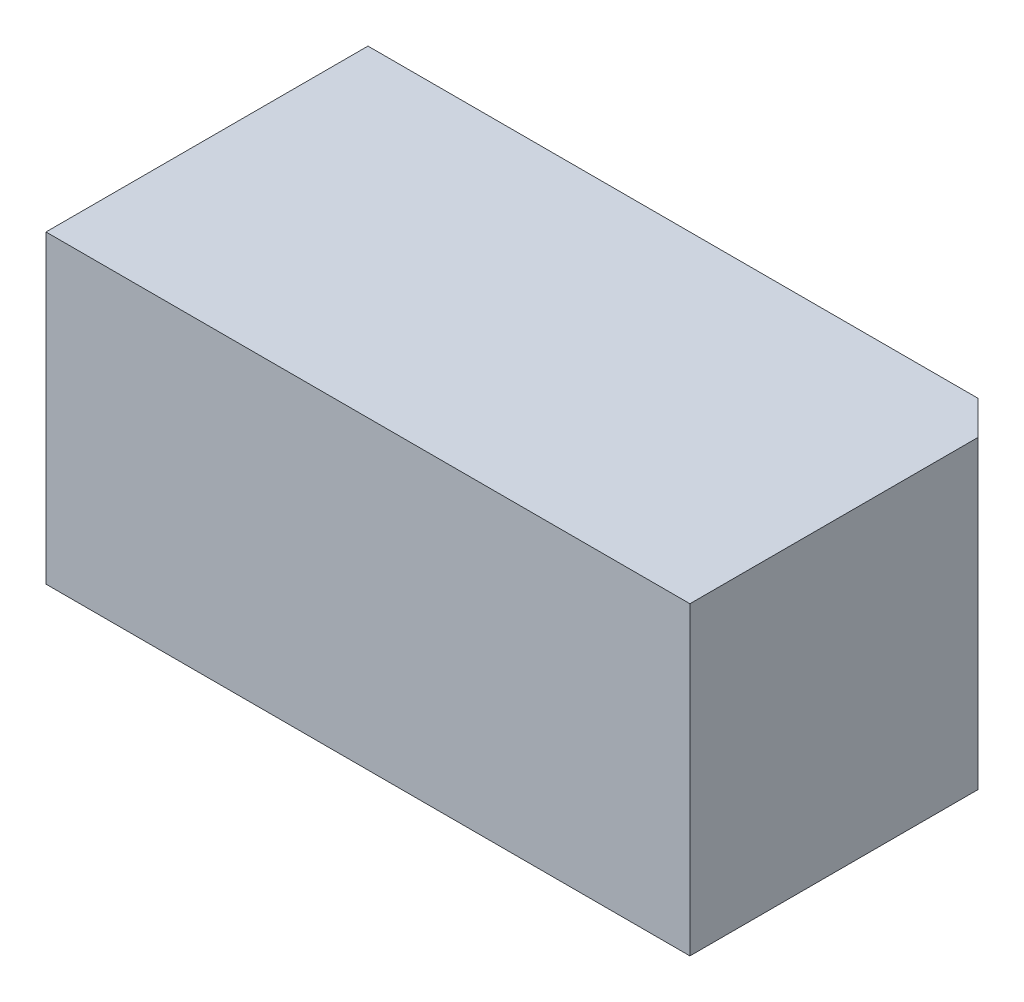
ISO-10303-21;
HEADER;
FILE_DESCRIPTION(('STEP AP214'),'2;1');
FILE_NAME('part.step','',(''),(''),'','','');
FILE_SCHEMA(('AUTOMOTIVE_DESIGN { 1 0 10303 214 1 1 1 1 }'));
ENDSEC;
DATA;
#1=APPLICATION_CONTEXT('core data for automotive mechanical design processes');
#2=APPLICATION_PROTOCOL_DEFINITION('international standard','automotive_design',2000,#1);
#3=PRODUCT_CONTEXT('',#1,'mechanical');
#4=PRODUCT('Part','Part','',(#3));
#5=PRODUCT_RELATED_PRODUCT_CATEGORY('part','',(#4));
#6=PRODUCT_DEFINITION_FORMATION('','',#4);
#7=PRODUCT_DEFINITION_CONTEXT('part definition',#1,'design');
#8=PRODUCT_DEFINITION('design','',#6,#7);
#9=PRODUCT_DEFINITION_SHAPE('','',#8);
#10=(LENGTH_UNIT() NAMED_UNIT(*) SI_UNIT(.MILLI.,.METRE.));
#11=(NAMED_UNIT(*) PLANE_ANGLE_UNIT() SI_UNIT($,.RADIAN.));
#12=(NAMED_UNIT(*) SI_UNIT($,.STERADIAN.) SOLID_ANGLE_UNIT());
#13=UNCERTAINTY_MEASURE_WITH_UNIT(LENGTH_MEASURE(1.E-05),#10,'distance_accuracy_value','');
#14=(GEOMETRIC_REPRESENTATION_CONTEXT(3) GLOBAL_UNCERTAINTY_ASSIGNED_CONTEXT((#13)) GLOBAL_UNIT_ASSIGNED_CONTEXT((#10,
#11,#12)) REPRESENTATION_CONTEXT('',''));
#15=CARTESIAN_POINT('',(0.,0.,0.));
#16=DIRECTION('',(0.,0.,1.));
#17=DIRECTION('',(1.,0.,0.));
#18=AXIS2_PLACEMENT_3D('',#15,#16,#17);
#19=CARTESIAN_POINT('',(-19.,18.,9.5));
#20=DIRECTION('',(1.,0.,0.));
#21=DIRECTION('',(0.,0.,-1.));
#22=AXIS2_PLACEMENT_3D('',#19,#20,#21);
#23=PLANE('',#22);
#24=DIRECTION('',(0.,0.,1.));
#25=VECTOR('',#24,1.);
#26=CARTESIAN_POINT('',(-19.,0.,9.5));
#27=LINE('',#26,#25);
#28=CARTESIAN_POINT('',(-19.,0.,-9.5));
#29=VERTEX_POINT('',#28);
#30=CARTESIAN_POINT('',(-19.,0.,9.5));
#31=VERTEX_POINT('',#30);
#32=EDGE_CURVE('E120',#29,#31,#27,.T.);
#33=ORIENTED_EDGE('',*,*,#32,.T.);
#34=DIRECTION('',(0.,-1.,0.));
#35=VECTOR('',#34,1.);
#36=CARTESIAN_POINT('',(-19.,18.,9.5));
#37=LINE('',#36,#35);
#38=CARTESIAN_POINT('',(-19.,18.,9.5));
#39=VERTEX_POINT('',#38);
#40=EDGE_CURVE('E11',#39,#31,#37,.T.);
#41=ORIENTED_EDGE('',*,*,#40,.F.);
#42=DIRECTION('',(0.,0.,1.));
#43=VECTOR('',#42,1.);
#44=CARTESIAN_POINT('',(-19.,18.,9.5));
#45=LINE('',#44,#43);
#46=CARTESIAN_POINT('',(-19.,18.,-9.5));
#47=VERTEX_POINT('',#46);
#48=EDGE_CURVE('E134',#47,#39,#45,.T.);
#49=ORIENTED_EDGE('',*,*,#48,.F.);
#50=DIRECTION('',(0.,-1.,0.));
#51=VECTOR('',#50,1.);
#52=CARTESIAN_POINT('',(-19.,18.,-9.5));
#53=LINE('',#52,#51);
#54=EDGE_CURVE('E116',#47,#29,#53,.T.);
#55=ORIENTED_EDGE('',*,*,#54,.T.);
#56=EDGE_LOOP('',(#33,#41,#49,#55));
#57=FACE_BOUND('',#56,.T.);
#58=ADVANCED_FACE('F40',(#57),#23,.F.);
#59=CARTESIAN_POINT('',(-19.,18.,9.5));
#60=DIRECTION('',(0.,0.,-1.));
#61=DIRECTION('',(-1.,0.,0.));
#62=AXIS2_PLACEMENT_3D('',#59,#60,#61);
#63=PLANE('',#62);
#64=DIRECTION('',(1.,0.,0.));
#65=VECTOR('',#64,1.);
#66=CARTESIAN_POINT('',(-19.,0.,9.5));
#67=LINE('',#66,#65);
#68=CARTESIAN_POINT('',(19.,0.,9.5));
#69=VERTEX_POINT('',#68);
#70=EDGE_CURVE('E124',#31,#69,#67,.T.);
#71=ORIENTED_EDGE('',*,*,#70,.T.);
#72=DIRECTION('',(0.,-1.,0.));
#73=VECTOR('',#72,1.);
#74=CARTESIAN_POINT('',(19.,18.,9.5));
#75=LINE('',#74,#73);
#76=CARTESIAN_POINT('',(19.,18.,9.5));
#77=VERTEX_POINT('',#76);
#78=EDGE_CURVE('E49',#77,#69,#75,.T.);
#79=ORIENTED_EDGE('',*,*,#78,.F.);
#80=DIRECTION('',(1.,0.,0.));
#81=VECTOR('',#80,1.);
#82=CARTESIAN_POINT('',(-19.,18.,9.5));
#83=LINE('',#82,#81);
#84=EDGE_CURVE('E91',#39,#77,#83,.T.);
#85=ORIENTED_EDGE('',*,*,#84,.F.);
#86=ORIENTED_EDGE('',*,*,#40,.T.);
#87=EDGE_LOOP('',(#71,#79,#85,#86));
#88=FACE_BOUND('',#87,.T.);
#89=ADVANCED_FACE('F158',(#88),#63,.F.);
#90=CARTESIAN_POINT('',(19.,18.,9.5));
#91=DIRECTION('',(-1.,0.,0.));
#92=DIRECTION('',(0.,0.,1.));
#93=AXIS2_PLACEMENT_3D('',#90,#91,#92);
#94=PLANE('',#93);
#95=DIRECTION('',(0.,0.,-1.));
#96=VECTOR('',#95,1.);
#97=CARTESIAN_POINT('',(19.,0.,9.5));
#98=LINE('',#97,#96);
#99=CARTESIAN_POINT('',(19.,0.,-7.5));
#100=VERTEX_POINT('',#99);
#101=EDGE_CURVE('E107',#69,#100,#98,.T.);
#102=ORIENTED_EDGE('',*,*,#101,.T.);
#103=DIRECTION('',(0.,-1.,0.));
#104=VECTOR('',#103,1.);
#105=CARTESIAN_POINT('',(19.,18.,-7.5));
#106=LINE('',#105,#104);
#107=CARTESIAN_POINT('',(19.,18.,-7.5));
#108=VERTEX_POINT('',#107);
#109=EDGE_CURVE('E104',#108,#100,#106,.T.);
#110=ORIENTED_EDGE('',*,*,#109,.F.);
#111=DIRECTION('',(0.,0.,-1.));
#112=VECTOR('',#111,1.);
#113=CARTESIAN_POINT('',(19.,18.,9.5));
#114=LINE('',#113,#112);
#115=EDGE_CURVE('E95',#77,#108,#114,.T.);
#116=ORIENTED_EDGE('',*,*,#115,.F.);
#117=ORIENTED_EDGE('',*,*,#78,.T.);
#118=EDGE_LOOP('',(#102,#110,#116,#117));
#119=FACE_BOUND('',#118,.T.);
#120=ADVANCED_FACE('F105',(#119),#94,.F.);
#121=CARTESIAN_POINT('',(17.,18.,-9.5));
#122=DIRECTION('',(-0.707106781186547,0.,0.707106781186548));
#123=DIRECTION('',(0.707106781186548,0.,0.707106781186547));
#124=AXIS2_PLACEMENT_3D('',#121,#122,#123);
#125=PLANE('',#124);
#126=DIRECTION('',(-0.707106781186548,0.,-0.707106781186547));
#127=VECTOR('',#126,1.);
#128=CARTESIAN_POINT('',(17.,0.,-9.5));
#129=LINE('',#128,#127);
#130=CARTESIAN_POINT('',(17.,0.,-9.5));
#131=VERTEX_POINT('',#130);
#132=EDGE_CURVE('E77',#100,#131,#129,.T.);
#133=ORIENTED_EDGE('',*,*,#132,.T.);
#134=DIRECTION('',(0.,-1.,0.));
#135=VECTOR('',#134,1.);
#136=CARTESIAN_POINT('',(17.,18.,-9.5));
#137=LINE('',#136,#135);
#138=CARTESIAN_POINT('',(17.,18.,-9.5));
#139=VERTEX_POINT('',#138);
#140=EDGE_CURVE('E109',#139,#131,#137,.T.);
#141=ORIENTED_EDGE('',*,*,#140,.F.);
#142=DIRECTION('',(-0.707106781186548,0.,-0.707106781186547));
#143=VECTOR('',#142,1.);
#144=CARTESIAN_POINT('',(17.,18.,-9.5));
#145=LINE('',#144,#143);
#146=EDGE_CURVE('E99',#108,#139,#145,.T.);
#147=ORIENTED_EDGE('',*,*,#146,.F.);
#148=ORIENTED_EDGE('',*,*,#109,.T.);
#149=EDGE_LOOP('',(#133,#141,#147,#148));
#150=FACE_BOUND('',#149,.T.);
#151=ADVANCED_FACE('F111',(#150),#125,.F.);
#152=CARTESIAN_POINT('',(-19.,18.,-9.5));
#153=DIRECTION('',(0.,0.,1.));
#154=DIRECTION('',(1.,0.,0.));
#155=AXIS2_PLACEMENT_3D('',#152,#153,#154);
#156=PLANE('',#155);
#157=DIRECTION('',(-1.,0.,0.));
#158=VECTOR('',#157,1.);
#159=CARTESIAN_POINT('',(-19.,0.,-9.5));
#160=LINE('',#159,#158);
#161=EDGE_CURVE('E83',#131,#29,#160,.T.);
#162=ORIENTED_EDGE('',*,*,#161,.T.);
#163=ORIENTED_EDGE('',*,*,#54,.F.);
#164=DIRECTION('',(-1.,0.,0.));
#165=VECTOR('',#164,1.);
#166=CARTESIAN_POINT('',(-19.,18.,-9.5));
#167=LINE('',#166,#165);
#168=EDGE_CURVE('E57',#139,#47,#167,.T.);
#169=ORIENTED_EDGE('',*,*,#168,.F.);
#170=ORIENTED_EDGE('',*,*,#140,.T.);
#171=EDGE_LOOP('',(#162,#163,#169,#170));
#172=FACE_BOUND('',#171,.T.);
#173=ADVANCED_FACE('F147',(#172),#156,.F.);
#174=CARTESIAN_POINT('',(0.,18.,0.));
#175=DIRECTION('',(0.,-1.,0.));
#176=DIRECTION('',(0.,0.,-1.));
#177=AXIS2_PLACEMENT_3D('',#174,#175,#176);
#178=PLANE('',#177);
#179=ORIENTED_EDGE('',*,*,#48,.T.);
#180=ORIENTED_EDGE('',*,*,#84,.T.);
#181=ORIENTED_EDGE('',*,*,#115,.T.);
#182=ORIENTED_EDGE('',*,*,#146,.T.);
#183=ORIENTED_EDGE('',*,*,#168,.T.);
#184=EDGE_LOOP('',(#179,#180,#181,#182,#183));
#185=FACE_BOUND('',#184,.T.);
#186=ADVANCED_FACE('F97',(#185),#178,.F.);
#187=CARTESIAN_POINT('',(0.,0.,0.));
#188=DIRECTION('',(0.,-1.,0.));
#189=DIRECTION('',(0.,0.,-1.));
#190=AXIS2_PLACEMENT_3D('',#187,#188,#189);
#191=PLANE('',#190);
#192=CARTESIAN_POINT('',(15.75,0.,-4.05));
#193=DIRECTION('',(0.,-1.,0.));
#194=DIRECTION('',(0.,0.,-1.));
#195=AXIS2_PLACEMENT_3D('',#192,#193,#194);
#196=CIRCLE('',#195,0.400000000000001);
#197=CARTESIAN_POINT('',(15.75,0.,-4.45));
#198=VERTEX_POINT('',#197);
#199=EDGE_CURVE('E304',#198,#198,#196,.T.);
#200=ORIENTED_EDGE('',*,*,#199,.F.);
#201=EDGE_LOOP('',(#200));
#202=FACE_BOUND('',#201,.T.);
#203=CARTESIAN_POINT('',(15.75,0.,4.05));
#204=DIRECTION('',(0.,-1.,0.));
#205=DIRECTION('',(0.,0.,-1.));
#206=AXIS2_PLACEMENT_3D('',#203,#204,#205);
#207=CIRCLE('',#206,0.400000000000001);
#208=CARTESIAN_POINT('',(15.75,0.,3.65));
#209=VERTEX_POINT('',#208);
#210=EDGE_CURVE('E303',#209,#209,#207,.T.);
#211=ORIENTED_EDGE('',*,*,#210,.F.);
#212=EDGE_LOOP('',(#211));
#213=FACE_BOUND('',#212,.T.);
#214=CARTESIAN_POINT('',(-15.75,0.,-5.35));
#215=DIRECTION('',(0.,-1.,0.));
#216=DIRECTION('',(0.,0.,-1.));
#217=AXIS2_PLACEMENT_3D('',#214,#215,#216);
#218=CIRCLE('',#217,0.4);
#219=CARTESIAN_POINT('',(-15.75,0.,-5.75));
#220=VERTEX_POINT('',#219);
#221=EDGE_CURVE('E316',#220,#220,#218,.T.);
#222=ORIENTED_EDGE('',*,*,#221,.F.);
#223=EDGE_LOOP('',(#222));
#224=FACE_BOUND('',#223,.T.);
#225=CARTESIAN_POINT('',(-15.75,0.,5.35));
#226=DIRECTION('',(0.,-1.,0.));
#227=DIRECTION('',(0.,0.,-1.));
#228=AXIS2_PLACEMENT_3D('',#225,#226,#227);
#229=CIRCLE('',#228,0.4);
#230=CARTESIAN_POINT('',(-15.75,0.,4.95));
#231=VERTEX_POINT('',#230);
#232=EDGE_CURVE('E322',#231,#231,#229,.T.);
#233=ORIENTED_EDGE('',*,*,#232,.F.);
#234=EDGE_LOOP('',(#233));
#235=FACE_BOUND('',#234,.T.);
#236=ORIENTED_EDGE('',*,*,#32,.F.);
#237=ORIENTED_EDGE('',*,*,#161,.F.);
#238=ORIENTED_EDGE('',*,*,#132,.F.);
#239=ORIENTED_EDGE('',*,*,#101,.F.);
#240=ORIENTED_EDGE('',*,*,#70,.F.);
#241=EDGE_LOOP('',(#236,#237,#238,#239,#240));
#242=FACE_BOUND('',#241,.T.);
#243=ADVANCED_FACE('F143',(#202,#213,#224,#235,#242),#191,.T.);
#244=CARTESIAN_POINT('',(-15.75,-2.,5.35));
#245=DIRECTION('',(0.,1.,0.));
#246=DIRECTION('',(0.,0.,1.));
#247=AXIS2_PLACEMENT_3D('',#244,#245,#246);
#248=CYLINDRICAL_SURFACE('',#247,0.4);
#249=CARTESIAN_POINT('',(-15.75,-2.,5.35));
#250=DIRECTION('',(0.,-1.,0.));
#251=DIRECTION('',(0.,0.,-1.));
#252=AXIS2_PLACEMENT_3D('',#249,#250,#251);
#253=CIRCLE('',#252,0.4);
#254=CARTESIAN_POINT('',(-15.75,-2.,4.95));
#255=VERTEX_POINT('',#254);
#256=EDGE_CURVE('E125',#255,#255,#253,.T.);
#257=ORIENTED_EDGE('',*,*,#256,.F.);
#258=EDGE_LOOP('',(#257));
#259=FACE_BOUND('',#258,.T.);
#260=ORIENTED_EDGE('',*,*,#232,.T.);
#261=EDGE_LOOP('',(#260));
#262=FACE_BOUND('',#261,.T.);
#263=ADVANCED_FACE('F186',(#259,#262),#248,.T.);
#264=CARTESIAN_POINT('',(-15.75,-2.,5.35));
#265=DIRECTION('',(0.,-1.,0.));
#266=DIRECTION('',(0.,0.,-1.));
#267=AXIS2_PLACEMENT_3D('',#264,#265,#266);
#268=PLANE('',#267);
#269=ORIENTED_EDGE('',*,*,#256,.T.);
#270=EDGE_LOOP('',(#269));
#271=FACE_BOUND('',#270,.T.);
#272=ADVANCED_FACE('F194',(#271),#268,.T.);
#273=CARTESIAN_POINT('',(-15.75,-2.,-5.35));
#274=DIRECTION('',(0.,1.,0.));
#275=DIRECTION('',(0.,0.,1.));
#276=AXIS2_PLACEMENT_3D('',#273,#274,#275);
#277=CYLINDRICAL_SURFACE('',#276,0.4);
#278=CARTESIAN_POINT('',(-15.75,-2.,-5.35));
#279=DIRECTION('',(0.,-1.,0.));
#280=DIRECTION('',(0.,0.,-1.));
#281=AXIS2_PLACEMENT_3D('',#278,#279,#280);
#282=CIRCLE('',#281,0.4);
#283=CARTESIAN_POINT('',(-15.75,-2.,-5.75));
#284=VERTEX_POINT('',#283);
#285=EDGE_CURVE('E318',#284,#284,#282,.T.);
#286=ORIENTED_EDGE('',*,*,#285,.F.);
#287=EDGE_LOOP('',(#286));
#288=FACE_BOUND('',#287,.T.);
#289=ORIENTED_EDGE('',*,*,#221,.T.);
#290=EDGE_LOOP('',(#289));
#291=FACE_BOUND('',#290,.T.);
#292=ADVANCED_FACE('F203',(#288,#291),#277,.T.);
#293=CARTESIAN_POINT('',(-15.75,-2.,-5.35));
#294=DIRECTION('',(0.,-1.,0.));
#295=DIRECTION('',(0.,0.,-1.));
#296=AXIS2_PLACEMENT_3D('',#293,#294,#295);
#297=PLANE('',#296);
#298=ORIENTED_EDGE('',*,*,#285,.T.);
#299=EDGE_LOOP('',(#298));
#300=FACE_BOUND('',#299,.T.);
#301=ADVANCED_FACE('F212',(#300),#297,.T.);
#302=CARTESIAN_POINT('',(15.75,-2.,4.05));
#303=DIRECTION('',(0.,1.,0.));
#304=DIRECTION('',(0.,0.,1.));
#305=AXIS2_PLACEMENT_3D('',#302,#303,#304);
#306=CYLINDRICAL_SURFACE('',#305,0.400000000000001);
#307=CARTESIAN_POINT('',(15.75,-2.,4.05));
#308=DIRECTION('',(0.,-1.,0.));
#309=DIRECTION('',(0.,0.,-1.));
#310=AXIS2_PLACEMENT_3D('',#307,#308,#309);
#311=CIRCLE('',#310,0.400000000000001);
#312=CARTESIAN_POINT('',(15.75,-2.,3.65));
#313=VERTEX_POINT('',#312);
#314=EDGE_CURVE('E308',#313,#313,#311,.T.);
#315=ORIENTED_EDGE('',*,*,#314,.F.);
#316=EDGE_LOOP('',(#315));
#317=FACE_BOUND('',#316,.T.);
#318=ORIENTED_EDGE('',*,*,#210,.T.);
#319=EDGE_LOOP('',(#318));
#320=FACE_BOUND('',#319,.T.);
#321=ADVANCED_FACE('F221',(#317,#320),#306,.T.);
#322=CARTESIAN_POINT('',(15.75,-2.,4.05));
#323=DIRECTION('',(0.,-1.,0.));
#324=DIRECTION('',(0.,0.,-1.));
#325=AXIS2_PLACEMENT_3D('',#322,#323,#324);
#326=PLANE('',#325);
#327=ORIENTED_EDGE('',*,*,#314,.T.);
#328=EDGE_LOOP('',(#327));
#329=FACE_BOUND('',#328,.T.);
#330=ADVANCED_FACE('F230',(#329),#326,.T.);
#331=CARTESIAN_POINT('',(15.75,-2.,-4.05));
#332=DIRECTION('',(0.,1.,0.));
#333=DIRECTION('',(0.,0.,1.));
#334=AXIS2_PLACEMENT_3D('',#331,#332,#333);
#335=CYLINDRICAL_SURFACE('',#334,0.400000000000001);
#336=CARTESIAN_POINT('',(15.75,-2.,-4.05));
#337=DIRECTION('',(0.,-1.,0.));
#338=DIRECTION('',(0.,0.,-1.));
#339=AXIS2_PLACEMENT_3D('',#336,#337,#338);
#340=CIRCLE('',#339,0.400000000000001);
#341=CARTESIAN_POINT('',(15.75,-2.,-4.45));
#342=VERTEX_POINT('',#341);
#343=EDGE_CURVE('E301',#342,#342,#340,.T.);
#344=ORIENTED_EDGE('',*,*,#343,.F.);
#345=EDGE_LOOP('',(#344));
#346=FACE_BOUND('',#345,.T.);
#347=ORIENTED_EDGE('',*,*,#199,.T.);
#348=EDGE_LOOP('',(#347));
#349=FACE_BOUND('',#348,.T.);
#350=ADVANCED_FACE('F239',(#346,#349),#335,.T.);
#351=CARTESIAN_POINT('',(15.75,-2.,-4.05));
#352=DIRECTION('',(0.,-1.,0.));
#353=DIRECTION('',(0.,0.,-1.));
#354=AXIS2_PLACEMENT_3D('',#351,#352,#353);
#355=PLANE('',#354);
#356=ORIENTED_EDGE('',*,*,#343,.T.);
#357=EDGE_LOOP('',(#356));
#358=FACE_BOUND('',#357,.T.);
#359=ADVANCED_FACE('F248',(#358),#355,.T.);
#360=CLOSED_SHELL('',(#58,#89,#120,#151,#173,#186,#243,#263,#272,#292,#301,#321,#330,#350,#359));
#361=MANIFOLD_SOLID_BREP('B2',#360);
#362=ADVANCED_BREP_SHAPE_REPRESENTATION('',(#18,#361),#14);
#363=SHAPE_DEFINITION_REPRESENTATION(#9,#362);
ENDSEC;
END-ISO-10303-21;
